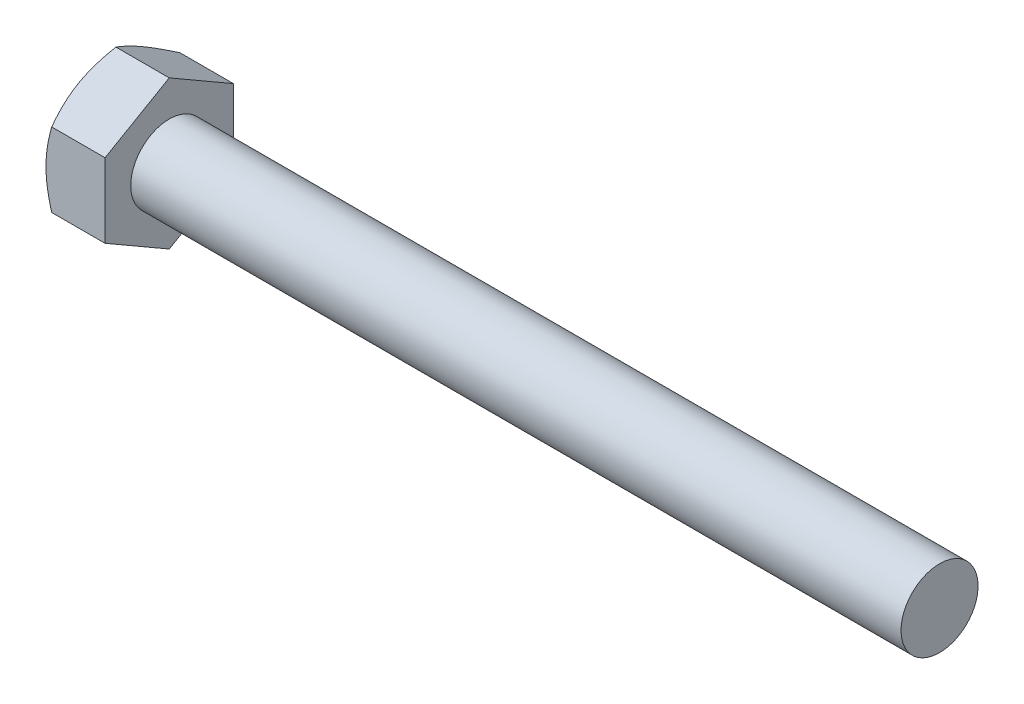
ISO-10303-21;
HEADER;
FILE_DESCRIPTION(('STEP AP214'),'2;1');
FILE_NAME('part.step','',(''),(''),'','','');
FILE_SCHEMA(('AUTOMOTIVE_DESIGN { 1 0 10303 214 1 1 1 1 }'));
ENDSEC;
DATA;
#1=APPLICATION_CONTEXT('core data for automotive mechanical design processes');
#2=APPLICATION_PROTOCOL_DEFINITION('international standard','automotive_design',2000,#1);
#3=PRODUCT_CONTEXT('',#1,'mechanical');
#4=PRODUCT('Part','Part','',(#3));
#5=PRODUCT_RELATED_PRODUCT_CATEGORY('part','',(#4));
#6=PRODUCT_DEFINITION_FORMATION('','',#4);
#7=PRODUCT_DEFINITION_CONTEXT('part definition',#1,'design');
#8=PRODUCT_DEFINITION('design','',#6,#7);
#9=PRODUCT_DEFINITION_SHAPE('','',#8);
#10=(LENGTH_UNIT() NAMED_UNIT(*) SI_UNIT(.MILLI.,.METRE.));
#11=(NAMED_UNIT(*) PLANE_ANGLE_UNIT() SI_UNIT($,.RADIAN.));
#12=(NAMED_UNIT(*) SI_UNIT($,.STERADIAN.) SOLID_ANGLE_UNIT());
#13=UNCERTAINTY_MEASURE_WITH_UNIT(LENGTH_MEASURE(1.E-05),#10,'distance_accuracy_value','');
#14=(GEOMETRIC_REPRESENTATION_CONTEXT(3) GLOBAL_UNCERTAINTY_ASSIGNED_CONTEXT((#13)) GLOBAL_UNIT_ASSIGNED_CONTEXT((#10,
#11,#12)) REPRESENTATION_CONTEXT('',''));
#15=CARTESIAN_POINT('',(0.,0.,0.));
#16=DIRECTION('',(0.,0.,1.));
#17=DIRECTION('',(1.,0.,0.));
#18=AXIS2_PLACEMENT_3D('',#15,#16,#17);
#19=CARTESIAN_POINT('',(0.,0.,0.));
#20=DIRECTION('',(-1.,0.,0.));
#21=DIRECTION('',(0.,0.,1.));
#22=AXIS2_PLACEMENT_3D('',#19,#20,#21);
#23=PLANE('',#22);
#24=CARTESIAN_POINT('',(0.,0.,0.));
#25=DIRECTION('',(-1.,0.,0.));
#26=DIRECTION('',(0.,0.,1.));
#27=AXIS2_PLACEMENT_3D('',#24,#25,#26);
#28=CIRCLE('',#27,2.5);
#29=CARTESIAN_POINT('',(0.,0.,2.5));
#30=VERTEX_POINT('',#29);
#31=CARTESIAN_POINT('',(0.,2.16506351419174,1.25000000819361));
#32=VERTEX_POINT('',#31);
#33=EDGE_CURVE('E40',#30,#32,#28,.T.);
#34=ORIENTED_EDGE('',*,*,#33,.T.);
#35=CARTESIAN_POINT('',(0.,2.16506351419174,-1.25000000819361));
#36=VERTEX_POINT('',#35);
#37=EDGE_CURVE('E196',#32,#36,#28,.T.);
#38=ORIENTED_EDGE('',*,*,#37,.T.);
#39=CARTESIAN_POINT('',(0.,0.,-2.5));
#40=VERTEX_POINT('',#39);
#41=EDGE_CURVE('E201',#36,#40,#28,.T.);
#42=ORIENTED_EDGE('',*,*,#41,.T.);
#43=CARTESIAN_POINT('',(0.,-2.16506351419155,-1.2500000081935));
#44=VERTEX_POINT('',#43);
#45=EDGE_CURVE('E205',#40,#44,#28,.T.);
#46=ORIENTED_EDGE('',*,*,#45,.T.);
#47=CARTESIAN_POINT('',(0.,-2.16506351419155,1.25000000819349));
#48=VERTEX_POINT('',#47);
#49=EDGE_CURVE('E202',#44,#48,#28,.T.);
#50=ORIENTED_EDGE('',*,*,#49,.T.);
#51=EDGE_CURVE('E194',#48,#30,#28,.T.);
#52=ORIENTED_EDGE('',*,*,#51,.T.);
#53=EDGE_LOOP('',(#34,#38,#42,#46,#50,#52));
#54=FACE_BOUND('',#53,.T.);
#55=CARTESIAN_POINT('',(0.,0.,0.));
#56=DIRECTION('',(1.,0.,0.));
#57=DIRECTION('',(0.,0.,-1.));
#58=AXIS2_PLACEMENT_3D('',#55,#56,#57);
#59=CIRCLE('',#58,2.1875);
#60=CARTESIAN_POINT('',(0.,0.,-2.1875));
#61=VERTEX_POINT('',#60);
#62=EDGE_CURVE('E233',#61,#61,#59,.T.);
#63=ORIENTED_EDGE('',*,*,#62,.T.);
#64=EDGE_LOOP('',(#63));
#65=FACE_BOUND('',#64,.T.);
#66=ADVANCED_FACE('F32',(#54,#65),#23,.T.);
#67=CARTESIAN_POINT('',(2.3,1.5,0.));
#68=DIRECTION('',(-1.,0.,0.));
#69=DIRECTION('',(0.,0.,1.));
#70=AXIS2_PLACEMENT_3D('',#67,#68,#69);
#71=PLANE('',#70);
#72=CARTESIAN_POINT('',(2.3,0.,0.));
#73=DIRECTION('',(-1.,0.,0.));
#74=DIRECTION('',(0.,0.,1.));
#75=AXIS2_PLACEMENT_3D('',#72,#73,#74);
#76=CIRCLE('',#75,1.5);
#77=CARTESIAN_POINT('',(2.3,0.,1.5));
#78=VERTEX_POINT('',#77);
#79=EDGE_CURVE('E192',#78,#78,#76,.T.);
#80=ORIENTED_EDGE('',*,*,#79,.T.);
#81=EDGE_LOOP('',(#80));
#82=FACE_BOUND('',#81,.T.);
#83=DIRECTION('',(0.,1.,0.));
#84=VECTOR('',#83,1.);
#85=CARTESIAN_POINT('',(2.3,-1.44337567928133,2.5));
#86=LINE('',#85,#84);
#87=CARTESIAN_POINT('',(2.3,-1.44337567928133,2.5));
#88=VERTEX_POINT('',#87);
#89=CARTESIAN_POINT('',(2.3,1.44337567928159,2.5));
#90=VERTEX_POINT('',#89);
#91=EDGE_CURVE('E55',#88,#90,#86,.T.);
#92=ORIENTED_EDGE('',*,*,#91,.F.);
#93=DIRECTION('',(0.,0.50000000163871,0.866025402838329));
#94=VECTOR('',#93,1.);
#95=CARTESIAN_POINT('',(2.3,-2.8867513585628,0.));
#96=LINE('',#95,#94);
#97=CARTESIAN_POINT('',(2.3,-2.8867513585628,0.));
#98=VERTEX_POINT('',#97);
#99=EDGE_CURVE('E129',#98,#88,#96,.T.);
#100=ORIENTED_EDGE('',*,*,#99,.F.);
#101=DIRECTION('',(0.,-0.50000000163871,0.866025402838329));
#102=VECTOR('',#101,1.);
#103=CARTESIAN_POINT('',(2.3,-1.44337567928133,-2.5));
#104=LINE('',#103,#102);
#105=CARTESIAN_POINT('',(2.3,-1.44337567928133,-2.5));
#106=VERTEX_POINT('',#105);
#107=EDGE_CURVE('E127',#106,#98,#104,.T.);
#108=ORIENTED_EDGE('',*,*,#107,.F.);
#109=DIRECTION('',(0.,-1.,0.));
#110=VECTOR('',#109,1.);
#111=CARTESIAN_POINT('',(2.3,1.44337567928159,-2.5));
#112=LINE('',#111,#110);
#113=CARTESIAN_POINT('',(2.3,1.44337567928159,-2.5));
#114=VERTEX_POINT('',#113);
#115=EDGE_CURVE('E109',#114,#106,#112,.T.);
#116=ORIENTED_EDGE('',*,*,#115,.F.);
#117=DIRECTION('',(0.,-0.500000001638711,-0.866025402838329));
#118=VECTOR('',#117,1.);
#119=CARTESIAN_POINT('',(2.3,2.88675135856305,0.));
#120=LINE('',#119,#118);
#121=CARTESIAN_POINT('',(2.3,2.88675135856305,0.));
#122=VERTEX_POINT('',#121);
#123=EDGE_CURVE('E118',#122,#114,#120,.T.);
#124=ORIENTED_EDGE('',*,*,#123,.F.);
#125=DIRECTION('',(0.,0.50000000163871,-0.866025402838329));
#126=VECTOR('',#125,1.);
#127=CARTESIAN_POINT('',(2.3,1.44337567928159,2.5));
#128=LINE('',#127,#126);
#129=EDGE_CURVE('E122',#90,#122,#128,.T.);
#130=ORIENTED_EDGE('',*,*,#129,.F.);
#131=EDGE_LOOP('',(#92,#100,#108,#116,#124,#130));
#132=FACE_BOUND('',#131,.T.);
#133=ADVANCED_FACE('F124',(#82,#132),#71,.F.);
#134=CARTESIAN_POINT('',(-25.4,0.,0.));
#135=DIRECTION('',(-1.,0.,0.));
#136=DIRECTION('',(0.,0.,1.));
#137=AXIS2_PLACEMENT_3D('',#134,#135,#136);
#138=CYLINDRICAL_SURFACE('',#137,1.5);
#139=CARTESIAN_POINT('',(32.3,0.,0.));
#140=DIRECTION('',(-1.,0.,0.));
#141=DIRECTION('',(0.,0.,1.));
#142=AXIS2_PLACEMENT_3D('',#139,#140,#141);
#143=CIRCLE('',#142,1.5);
#144=CARTESIAN_POINT('',(32.3,0.,1.5));
#145=VERTEX_POINT('',#144);
#146=EDGE_CURVE('E11',#145,#145,#143,.T.);
#147=ORIENTED_EDGE('',*,*,#146,.T.);
#148=EDGE_LOOP('',(#147));
#149=FACE_BOUND('',#148,.T.);
#150=ORIENTED_EDGE('',*,*,#79,.F.);
#151=EDGE_LOOP('',(#150));
#152=FACE_BOUND('',#151,.T.);
#153=ADVANCED_FACE('F34',(#149,#152),#138,.T.);
#154=CARTESIAN_POINT('',(32.3,1.5,0.));
#155=DIRECTION('',(1.,0.,0.));
#156=DIRECTION('',(0.,0.,-1.));
#157=AXIS2_PLACEMENT_3D('',#154,#155,#156);
#158=PLANE('',#157);
#159=ORIENTED_EDGE('',*,*,#146,.F.);
#160=EDGE_LOOP('',(#159));
#161=FACE_BOUND('',#160,.T.);
#162=ADVANCED_FACE('F175',(#161),#158,.T.);
#163=CARTESIAN_POINT('',(2.3,-1.44337567928133,2.5));
#164=DIRECTION('',(0.,0.,1.));
#165=DIRECTION('',(0.,-1.,0.));
#166=AXIS2_PLACEMENT_3D('',#163,#164,#165);
#167=PLANE('',#166);
#168=DIRECTION('',(-1.,0.,0.));
#169=VECTOR('',#168,1.);
#170=CARTESIAN_POINT('',(2.3,-1.44337567928133,2.5));
#171=LINE('',#170,#169);
#172=CARTESIAN_POINT('',(0.223290995513354,-1.44337567928133,2.5));
#173=VERTEX_POINT('',#172);
#174=EDGE_CURVE('E136',#88,#173,#171,.T.);
#175=ORIENTED_EDGE('',*,*,#174,.F.);
#176=ORIENTED_EDGE('',*,*,#91,.T.);
#177=DIRECTION('',(-1.,0.,0.));
#178=VECTOR('',#177,1.);
#179=CARTESIAN_POINT('',(2.3,1.44337567928159,2.5));
#180=LINE('',#179,#178);
#181=CARTESIAN_POINT('',(0.223290995513426,1.44337567928159,2.5));
#182=VERTEX_POINT('',#181);
#183=EDGE_CURVE('E135',#90,#182,#180,.T.);
#184=ORIENTED_EDGE('',*,*,#183,.T.);
#185=CARTESIAN_POINT('',(1.19632004406595,-3.82805178069449,2.5));
#186=CARTESIAN_POINT('',(1.14327589629636,-3.7182875906123,2.5));
#187=CARTESIAN_POINT('',(1.09075904917703,-3.60826388251005,2.5));
#188=CARTESIAN_POINT('',(0.987081273872629,-3.38755710903453,2.5));
#189=CARTESIAN_POINT('',(0.935920580448254,-3.27687393351173,2.5));
#190=CARTESIAN_POINT('',(0.834986914311905,-3.05411000573681,2.5));
#191=CARTESIAN_POINT('',(0.785223558317014,-2.94202488038616,2.5));
#192=CARTESIAN_POINT('',(0.687834293242499,-2.71693339089507,2.5));
#193=CARTESIAN_POINT('',(0.64020827274816,-2.60392707513802,2.5));
#194=CARTESIAN_POINT('',(0.547096599216495,-2.37541055612811,2.5));
#195=CARTESIAN_POINT('',(0.501644402476205,-2.25988664554279,2.5));
#196=CARTESIAN_POINT('',(0.414299798759199,-2.02747621227372,2.5));
#197=CARTESIAN_POINT('',(0.372407787833692,-1.91058953963062,2.5));
#198=CARTESIAN_POINT('',(0.293309177636011,-1.67550769213624,2.5));
#199=CARTESIAN_POINT('',(0.25609261725792,-1.55731590352552,2.5));
#200=CARTESIAN_POINT('',(0.187553577101156,-1.31925207497197,2.5));
#201=CARTESIAN_POINT('',(0.156229233411223,-1.19938057931484,2.5));
#202=CARTESIAN_POINT('',(0.100995335359192,-0.957875466950474,2.5));
#203=CARTESIAN_POINT('',(0.0770877549190802,-0.836241390144261,2.5));
#204=CARTESIAN_POINT('',(0.038297067354997,-0.591506739851932,2.5));
#205=CARTESIAN_POINT('',(0.0234139682023205,-0.468406165070562,2.5));
#206=CARTESIAN_POINT('',(0.00398887707067124,-0.222162283708564,2.5));
#207=CARTESIAN_POINT('',(-0.000618582954531749,-0.0990242760150257,2.5));
#208=CARTESIAN_POINT('',(0.000752385125690082,0.147165525321938,2.5));
#209=CARTESIAN_POINT('',(0.00672806531326639,0.270217333048273,2.5));
#210=CARTESIAN_POINT('',(0.0255487226845887,0.480345911839685,2.5));
#211=CARTESIAN_POINT('',(0.035942719418275,0.567654504214298,2.5));
#212=CARTESIAN_POINT('',(0.06138257495136,0.741597260879314,2.5));
#213=CARTESIAN_POINT('',(0.0764291673933794,0.828231316595431,2.5));
#214=CARTESIAN_POINT('',(0.127758160854861,1.0870510539617,2.5));
#215=CARTESIAN_POINT('',(0.170216562336699,1.258023566365,2.5));
#216=CARTESIAN_POINT('',(0.243445888381075,1.51385794210056,2.5));
#217=CARTESIAN_POINT('',(0.269819264012636,1.60005333907683,2.5));
#218=CARTESIAN_POINT('',(0.325175689355993,1.7715444847852,2.5));
#219=CARTESIAN_POINT('',(0.354156939094439,1.8568408093229,2.5));
#220=CARTESIAN_POINT('',(0.414126062328039,2.02617712827433,2.5));
#221=CARTESIAN_POINT('',(0.445101723039572,2.11022149180121,2.5));
#222=CARTESIAN_POINT('',(0.508871156887613,2.27765814571535,2.5));
#223=CARTESIAN_POINT('',(0.541665664837581,2.36105015679791,2.5));
#224=CARTESIAN_POINT('',(0.575190110848548,2.44414064056434,2.5));
#225=B_SPLINE_CURVE_WITH_KNOTS('',3,(#185,#186,#187,#188,#189,#190,#191,#192,#193,#194,#195,
#196,#197,#198,#199,#200,#201,#202,#203,#204,#205,#206,#207,#208,#209,#210,#211,#212,#213,#214,
#215,#216,#217,#218,#219,#220,#221,#222,#223,#224),.UNSPECIFIED.,.F.,.F.,(4,2,2,2,2,2,2,2,2,2,2,
2,2,2,2,2,2,2,2,4),(0.,0.365732583178816,0.731528069426235,1.0994168436567,1.46728641830588,
1.83967239293614,2.21209973939173,2.58371966044213,2.95522182687511,3.32682278147237,
3.69842406430308,4.06765095845392,4.43678199670504,4.70042859172476,4.96411678096691,
5.49188560395094,5.76228383952689,6.03249685521827,6.30118893346183,6.56999036530353),.UNSPECIFIED.);
#226=EDGE_CURVE('E177',#30,#182,#225,.T.);
#227=ORIENTED_EDGE('',*,*,#226,.F.);
#228=EDGE_CURVE('E184',#173,#30,#225,.T.);
#229=ORIENTED_EDGE('',*,*,#228,.F.);
#230=EDGE_LOOP('',(#175,#176,#184,#227,#229));
#231=FACE_BOUND('',#230,.T.);
#232=ADVANCED_FACE('F171',(#231),#167,.T.);
#233=CARTESIAN_POINT('',(2.3,-2.8867513585628,0.));
#234=DIRECTION('',(0.,-0.866025402838329,0.50000000163871));
#235=DIRECTION('',(0.,-0.50000000163871,-0.866025402838329));
#236=AXIS2_PLACEMENT_3D('',#233,#234,#235);
#237=PLANE('',#236);
#238=DIRECTION('',(-1.,0.,0.));
#239=VECTOR('',#238,1.);
#240=CARTESIAN_POINT('',(2.3,-2.8867513585628,0.));
#241=LINE('',#240,#239);
#242=CARTESIAN_POINT('',(0.223291000975684,-2.8867513585628,0.));
#243=VERTEX_POINT('',#242);
#244=EDGE_CURVE('E140',#98,#243,#241,.T.);
#245=ORIENTED_EDGE('',*,*,#244,.F.);
#246=ORIENTED_EDGE('',*,*,#99,.T.);
#247=ORIENTED_EDGE('',*,*,#174,.T.);
#248=CARTESIAN_POINT('',(0.223357671642482,-2.88686682861714,-0.000200000000002143));
#249=CARTESIAN_POINT('',(0.186721627123145,-2.823437260003,0.109663235061769));
#250=CARTESIAN_POINT('',(0.153402225713999,-2.75946017255779,0.220474800552922));
#251=CARTESIAN_POINT('',(0.0952422917887068,-2.63039811834957,0.444016834793908));
#252=CARTESIAN_POINT('',(0.0704223351272897,-2.5653108579734,0.556751276198269));
#253=CARTESIAN_POINT('',(0.0317856569546174,-2.43594298952786,0.780822996233657));
#254=CARTESIAN_POINT('',(0.0177118014837253,-2.37168228872263,0.892125794471915));
#255=CARTESIAN_POINT('',(0.00090915726963869,-2.24285844798616,1.11525523087859));
#256=CARTESIAN_POINT('',(-0.00183354404533533,-2.17829577643782,1.22708105778404));
#257=CARTESIAN_POINT('',(0.00386576449219331,-2.05765213161006,1.43604197932287));
#258=CARTESIAN_POINT('',(0.0109083986955486,-2.00155311785805,1.53320832097125));
#259=CARTESIAN_POINT('',(0.0332314230427739,-1.88972058300822,1.72690795242393));
#260=CARTESIAN_POINT('',(0.0485194421325142,-1.83398744884957,1.82344057202992));
#261=CARTESIAN_POINT('',(0.0867390970453047,-1.7219242510559,2.01753972341901));
#262=CARTESIAN_POINT('',(0.109832779058663,-1.66560837412358,2.11508168311234));
#263=CARTESIAN_POINT('',(0.162246658960904,-1.55381666130744,2.3087106087289));
#264=CARTESIAN_POINT('',(0.191554537725399,-1.49833939269559,2.40480005620986));
#265=CARTESIAN_POINT('',(0.223357666179496,-1.44326020922699,2.5002));
#266=B_SPLINE_CURVE_WITH_KNOTS('',3,(#248,#249,#250,#251,#252,#253,#254,#255,#256,#257,#258,
#259,#260,#261,#262,#263,#264,#265),.UNSPECIFIED.,.F.,.F.,(4,2,2,2,2,2,2,2,4),(0.,
0.396285829073732,0.793524333587548,1.18093087363639,1.56786160813528,1.90479742383017,
2.24204552159359,2.58677531937551,2.93082800409492),.UNSPECIFIED.);
#267=EDGE_CURVE('E186',#48,#173,#266,.T.);
#268=ORIENTED_EDGE('',*,*,#267,.F.);
#269=EDGE_CURVE('E185',#243,#48,#266,.T.);
#270=ORIENTED_EDGE('',*,*,#269,.F.);
#271=EDGE_LOOP('',(#245,#246,#247,#268,#270));
#272=FACE_BOUND('',#271,.T.);
#273=ADVANCED_FACE('F174',(#272),#237,.T.);
#274=CARTESIAN_POINT('',(2.3,-1.44337567928133,-2.5));
#275=DIRECTION('',(0.,-0.866025402838329,-0.500000001638711));
#276=DIRECTION('',(0.,0.500000001638711,-0.866025402838329));
#277=AXIS2_PLACEMENT_3D('',#274,#275,#276);
#278=PLANE('',#277);
#279=DIRECTION('',(-1.,0.,0.));
#280=VECTOR('',#279,1.);
#281=CARTESIAN_POINT('',(2.3,-1.44337567928133,-2.5));
#282=LINE('',#281,#280);
#283=CARTESIAN_POINT('',(0.223290995513354,-1.44337567928133,-2.5));
#284=VERTEX_POINT('',#283);
#285=EDGE_CURVE('E115',#106,#284,#282,.T.);
#286=ORIENTED_EDGE('',*,*,#285,.F.);
#287=ORIENTED_EDGE('',*,*,#107,.T.);
#288=ORIENTED_EDGE('',*,*,#244,.T.);
#289=CARTESIAN_POINT('',(0.223357666179497,-1.44326020922699,-2.5002));
#290=CARTESIAN_POINT('',(0.186721622105298,-1.5066897776876,-2.39033676520415));
#291=CARTESIAN_POINT('',(0.153402221169773,-1.57066686497833,-2.27952519998057));
#292=CARTESIAN_POINT('',(0.0952422882291777,-1.69972891886277,-2.05598316630038));
#293=CARTESIAN_POINT('',(0.0704223320783233,-1.76481617906955,-1.94324872518942));
#294=CARTESIAN_POINT('',(0.0317856549217439,-1.89418404716996,-1.71917700575181));
#295=CARTESIAN_POINT('',(0.0177117999573072,-1.95844474779999,-1.60787420781702));
#296=CARTESIAN_POINT('',(0.000909156719706351,-2.08726858816535,-1.38474477205312));
#297=CARTESIAN_POINT('',(-0.00183354412492823,-2.15183125951782,-1.27291894548693));
#298=CARTESIAN_POINT('',(0.00386576523131461,-2.2724749043379,-1.06395802396141));
#299=CARTESIAN_POINT('',(0.0109083998520712,-2.3285739182796,-0.966791681984467));
#300=CARTESIAN_POINT('',(0.0332314250552679,-2.44040645349358,-0.773092049901065));
#301=CARTESIAN_POINT('',(0.0485194445836655,-2.49613958782666,-0.676559429992937));
#302=CARTESIAN_POINT('',(0.0867391003778076,-2.60820278596567,-0.482460278005714));
#303=CARTESIAN_POINT('',(0.109832782834313,-2.66451866306857,-0.384918318016943));
#304=CARTESIAN_POINT('',(0.162246663600416,-2.77631037621612,-0.191289391826351));
#305=CARTESIAN_POINT('',(0.191554542785451,-2.83178764498885,-0.0951999440667299));
#306=CARTESIAN_POINT('',(0.223357671642482,-2.88686682861714,0.000199999999997729));
#307=B_SPLINE_CURVE_WITH_KNOTS('',3,(#289,#290,#291,#292,#293,#294,#295,#296,#297,#298,#299,
#300,#301,#302,#303,#304,#305,#306),.UNSPECIFIED.,.F.,.F.,(4,2,2,2,2,2,2,2,4),(0.,
0.396285827816312,0.793524331042151,1.18093086988015,1.56786160317875,1.90479742008592,
2.24204551906553,2.58677531811864,2.9308280040949),.UNSPECIFIED.);
#308=EDGE_CURVE('E215',#44,#243,#307,.T.);
#309=ORIENTED_EDGE('',*,*,#308,.F.);
#310=EDGE_CURVE('E220',#284,#44,#307,.T.);
#311=ORIENTED_EDGE('',*,*,#310,.F.);
#312=EDGE_LOOP('',(#286,#287,#288,#309,#311));
#313=FACE_BOUND('',#312,.T.);
#314=ADVANCED_FACE('F292',(#313),#278,.T.);
#315=CARTESIAN_POINT('',(2.3,1.44337567928159,-2.5));
#316=DIRECTION('',(0.,0.,-1.));
#317=DIRECTION('',(-1.,0.,0.));
#318=AXIS2_PLACEMENT_3D('',#315,#316,#317);
#319=PLANE('',#318);
#320=DIRECTION('',(-1.,0.,0.));
#321=VECTOR('',#320,1.);
#322=CARTESIAN_POINT('',(2.3,1.44337567928159,-2.5));
#323=LINE('',#322,#321);
#324=CARTESIAN_POINT('',(0.223290995513428,1.44337567928159,-2.5));
#325=VERTEX_POINT('',#324);
#326=EDGE_CURVE('E104',#114,#325,#323,.T.);
#327=ORIENTED_EDGE('',*,*,#326,.F.);
#328=ORIENTED_EDGE('',*,*,#115,.T.);
#329=ORIENTED_EDGE('',*,*,#285,.T.);
#330=CARTESIAN_POINT('',(1.19632004406595,-3.82805178069449,-2.5));
#331=CARTESIAN_POINT('',(1.14327589629636,-3.7182875906123,-2.5));
#332=CARTESIAN_POINT('',(1.09075904917702,-3.60826388251005,-2.5));
#333=CARTESIAN_POINT('',(0.987081273872628,-3.38755710903453,-2.5));
#334=CARTESIAN_POINT('',(0.935920580448254,-3.27687393351173,-2.5));
#335=CARTESIAN_POINT('',(0.834986914311905,-3.05411000573681,-2.5));
#336=CARTESIAN_POINT('',(0.785223558317014,-2.94202488038616,-2.5));
#337=CARTESIAN_POINT('',(0.687834293242499,-2.71693339089507,-2.5));
#338=CARTESIAN_POINT('',(0.64020827274816,-2.60392707513802,-2.5));
#339=CARTESIAN_POINT('',(0.547096599216495,-2.37541055612811,-2.5));
#340=CARTESIAN_POINT('',(0.501644402476205,-2.25988664554279,-2.5));
#341=CARTESIAN_POINT('',(0.414299798759198,-2.02747621227372,-2.5));
#342=CARTESIAN_POINT('',(0.372407787833692,-1.91058953963062,-2.5));
#343=CARTESIAN_POINT('',(0.293309177636012,-1.67550769213624,-2.5));
#344=CARTESIAN_POINT('',(0.25609261725792,-1.55731590352552,-2.5));
#345=CARTESIAN_POINT('',(0.187553577101156,-1.31925207497197,-2.5));
#346=CARTESIAN_POINT('',(0.156229233411224,-1.19938057931484,-2.5));
#347=CARTESIAN_POINT('',(0.100995335359192,-0.957875466950475,-2.5));
#348=CARTESIAN_POINT('',(0.0770877549190807,-0.836241390144261,-2.5));
#349=CARTESIAN_POINT('',(0.0382970673549975,-0.591506739851933,-2.5));
#350=CARTESIAN_POINT('',(0.0234139682023211,-0.468406165070562,-2.5));
#351=CARTESIAN_POINT('',(0.00398887707067217,-0.222162283708564,-2.5));
#352=CARTESIAN_POINT('',(-0.000618582954530538,-0.099024276015026,-2.5));
#353=CARTESIAN_POINT('',(0.00075238512569141,0.147165525321938,-2.5));
#354=CARTESIAN_POINT('',(0.00672806531326759,0.270217333048273,-2.5));
#355=CARTESIAN_POINT('',(0.02554872268459,0.480345911839686,-2.5));
#356=CARTESIAN_POINT('',(0.0359427194182764,0.567654504214298,-2.5));
#357=CARTESIAN_POINT('',(0.0613825749513615,0.741597260879314,-2.5));
#358=CARTESIAN_POINT('',(0.076429167393381,0.828231316595431,-2.5));
#359=CARTESIAN_POINT('',(0.127758160854862,1.0870510539617,-2.5));
#360=CARTESIAN_POINT('',(0.170216562336701,1.258023566365,-2.5));
#361=CARTESIAN_POINT('',(0.243445888381077,1.51385794210056,-2.5));
#362=CARTESIAN_POINT('',(0.269819264012639,1.60005333907683,-2.5));
#363=CARTESIAN_POINT('',(0.325175689355996,1.7715444847852,-2.5));
#364=CARTESIAN_POINT('',(0.354156939094442,1.8568408093229,-2.5));
#365=CARTESIAN_POINT('',(0.414126062328042,2.02617712827433,-2.5));
#366=CARTESIAN_POINT('',(0.445101723039575,2.11022149180121,-2.5));
#367=CARTESIAN_POINT('',(0.508871156887616,2.27765814571535,-2.5));
#368=CARTESIAN_POINT('',(0.541665664837584,2.36105015679791,-2.5));
#369=CARTESIAN_POINT('',(0.575190110848552,2.44414064056434,-2.5));
#370=B_SPLINE_CURVE_WITH_KNOTS('',3,(#330,#331,#332,#333,#334,#335,#336,#337,#338,#339,#340,
#341,#342,#343,#344,#345,#346,#347,#348,#349,#350,#351,#352,#353,#354,#355,#356,#357,#358,#359,
#360,#361,#362,#363,#364,#365,#366,#367,#368,#369),.UNSPECIFIED.,.F.,.F.,(4,2,2,2,2,2,2,2,2,2,2,
2,2,2,2,2,2,2,2,4),(0.,0.365732583178816,0.731528069426235,1.0994168436567,1.46728641830589,
1.83967239293614,2.21209973939173,2.58371966044213,2.95522182687511,3.32682278147237,
3.69842406430308,4.06765095845392,4.43678199670504,4.70042859172476,4.96411678096691,
5.49188560395094,5.7622838395269,6.03249685521827,6.30118893346184,6.56999036530353),.UNSPECIFIED.);
#371=EDGE_CURVE('E216',#40,#284,#370,.F.);
#372=ORIENTED_EDGE('',*,*,#371,.F.);
#373=EDGE_CURVE('E112',#325,#40,#370,.F.);
#374=ORIENTED_EDGE('',*,*,#373,.F.);
#375=EDGE_LOOP('',(#327,#328,#329,#372,#374));
#376=FACE_BOUND('',#375,.T.);
#377=ADVANCED_FACE('F106',(#376),#319,.T.);
#378=CARTESIAN_POINT('',(2.3,2.88675135856305,0.));
#379=DIRECTION('',(0.,0.866025402838329,-0.500000001638711));
#380=DIRECTION('',(0.,0.500000001638711,0.866025402838329));
#381=AXIS2_PLACEMENT_3D('',#378,#379,#380);
#382=PLANE('',#381);
#383=DIRECTION('',(-1.,0.,0.));
#384=VECTOR('',#383,1.);
#385=CARTESIAN_POINT('',(2.3,2.88675135856305,0.));
#386=LINE('',#385,#384);
#387=CARTESIAN_POINT('',(0.223291000975832,2.88675135856305,0.));
#388=VERTEX_POINT('',#387);
#389=EDGE_CURVE('E47',#122,#388,#386,.T.);
#390=ORIENTED_EDGE('',*,*,#389,.F.);
#391=ORIENTED_EDGE('',*,*,#123,.T.);
#392=ORIENTED_EDGE('',*,*,#326,.T.);
#393=CARTESIAN_POINT('',(0.22335767164263,2.8868668286174,0.000199999999997561));
#394=CARTESIAN_POINT('',(0.18672162712329,2.82343726000325,-0.109663235061783));
#395=CARTESIAN_POINT('',(0.153402225714141,2.75946017255803,-0.220474800552946));
#396=CARTESIAN_POINT('',(0.0952422917888434,2.6303981183498,-0.444016834793951));
#397=CARTESIAN_POINT('',(0.0704223351274241,2.56531085797362,-0.556751276198322));
#398=CARTESIAN_POINT('',(0.0317856569547485,2.43594298952808,-0.78082299623373));
#399=CARTESIAN_POINT('',(0.0177118014838551,2.37168228872284,-0.892125794471997));
#400=CARTESIAN_POINT('',(0.000909157269767128,2.24285844798636,-1.1152552308787));
#401=CARTESIAN_POINT('',(-0.00183354404520703,2.17829577643801,-1.22708105778415));
#402=CARTESIAN_POINT('',(0.00386576449232183,2.05765213161025,-1.43604197932298));
#403=CARTESIAN_POINT('',(0.0109083986956756,2.00155311785825,-1.53320832097135));
#404=CARTESIAN_POINT('',(0.0332314230428954,1.88972058300843,-1.72690795242401));
#405=CARTESIAN_POINT('',(0.0485194421326316,1.83398744884979,-1.82344057202999));
#406=CARTESIAN_POINT('',(0.0867390970454121,1.72192425105612,-2.01753972341906));
#407=CARTESIAN_POINT('',(0.109832779058765,1.66560837412381,-2.11508168311238));
#408=CARTESIAN_POINT('',(0.162246658960993,1.55381666130769,-2.30871060872892));
#409=CARTESIAN_POINT('',(0.19155453772548,1.49833939269584,-2.40480005620987));
#410=CARTESIAN_POINT('',(0.22335766617957,1.44326020922725,-2.5002));
#411=B_SPLINE_CURVE_WITH_KNOTS('',3,(#393,#394,#395,#396,#397,#398,#399,#400,#401,#402,#403,
#404,#405,#406,#407,#408,#409,#410),.UNSPECIFIED.,.F.,.F.,(4,2,2,2,2,2,2,2,4),(0.,
0.396285829073766,0.793524333587617,1.1809308736365,1.56786160813542,1.90479742383028,
2.24204552159366,2.58677531937554,2.93082800409491),.UNSPECIFIED.);
#412=EDGE_CURVE('E154',#36,#325,#411,.T.);
#413=ORIENTED_EDGE('',*,*,#412,.F.);
#414=EDGE_CURVE('E379',#388,#36,#411,.T.);
#415=ORIENTED_EDGE('',*,*,#414,.F.);
#416=EDGE_LOOP('',(#390,#391,#392,#413,#415));
#417=FACE_BOUND('',#416,.T.);
#418=ADVANCED_FACE('F119',(#417),#382,.T.);
#419=CARTESIAN_POINT('',(2.3,1.44337567928159,2.5));
#420=DIRECTION('',(0.,0.866025402838329,0.50000000163871));
#421=DIRECTION('',(0.,-0.50000000163871,0.866025402838329));
#422=AXIS2_PLACEMENT_3D('',#419,#420,#421);
#423=PLANE('',#422);
#424=ORIENTED_EDGE('',*,*,#183,.F.);
#425=ORIENTED_EDGE('',*,*,#129,.T.);
#426=ORIENTED_EDGE('',*,*,#389,.T.);
#427=CARTESIAN_POINT('',(0.223357666179569,1.44326020922725,2.5002));
#428=CARTESIAN_POINT('',(0.186721622105373,1.50668977768786,2.39033676520414));
#429=CARTESIAN_POINT('',(0.153402221169851,1.57066686497859,2.27952519998055));
#430=CARTESIAN_POINT('',(0.0952422882292643,1.69972891886304,2.05598316630036));
#431=CARTESIAN_POINT('',(0.0704223320784148,1.76481617906983,1.94324872518938));
#432=CARTESIAN_POINT('',(0.031785654921846,1.89418404717024,1.71917700575177));
#433=CARTESIAN_POINT('',(0.0177117999574148,1.95844474780027,1.60787420781697));
#434=CARTESIAN_POINT('',(0.000909156719825605,2.08726858816564,1.38474477205306));
#435=CARTESIAN_POINT('',(-0.00183354412480281,2.15183125951811,1.27291894548686));
#436=CARTESIAN_POINT('',(0.00386576523145128,2.27247490433819,1.06395802396134));
#437=CARTESIAN_POINT('',(0.0109083998522121,2.32857391827989,0.966791681984406));
#438=CARTESIAN_POINT('',(0.0332314250554149,2.44040645349386,0.773092049901015));
#439=CARTESIAN_POINT('',(0.0485194445838145,2.49613958782694,0.676559429992892));
#440=CARTESIAN_POINT('',(0.0867391003779589,2.60820278596594,0.482460278005681));
#441=CARTESIAN_POINT('',(0.109832782834465,2.66451866306883,0.384918318016915));
#442=CARTESIAN_POINT('',(0.162246663600566,2.77631037621638,0.191289391826335));
#443=CARTESIAN_POINT('',(0.191554542785601,2.83178764498911,0.0951999440667197));
#444=CARTESIAN_POINT('',(0.22335767164263,2.8868668286174,-0.000200000000002304));
#445=B_SPLINE_CURVE_WITH_KNOTS('',3,(#427,#428,#429,#430,#431,#432,#433,#434,#435,#436,#437,
#438,#439,#440,#441,#442,#443,#444),.UNSPECIFIED.,.F.,.F.,(4,2,2,2,2,2,2,2,4),(0.,
0.39628582781633,0.793524331042186,1.1809308698802,1.56786160317882,1.90479742008597,
2.24204551906556,2.58677531811865,2.93082800409489),.UNSPECIFIED.);
#446=EDGE_CURVE('E139',#32,#388,#445,.T.);
#447=ORIENTED_EDGE('',*,*,#446,.F.);
#448=EDGE_CURVE('E153',#182,#32,#445,.T.);
#449=ORIENTED_EDGE('',*,*,#448,.F.);
#450=EDGE_LOOP('',(#424,#425,#426,#447,#449));
#451=FACE_BOUND('',#450,.T.);
#452=ADVANCED_FACE('F164',(#451),#423,.T.);
#453=CARTESIAN_POINT('',(0.,0.,0.));
#454=DIRECTION('',(1.,0.,0.));
#455=DIRECTION('',(0.,0.,-1.));
#456=AXIS2_PLACEMENT_3D('',#453,#454,#455);
#457=CONICAL_SURFACE('',#456,2.5,1.0471975511966);
#458=ORIENTED_EDGE('',*,*,#51,.F.);
#459=ORIENTED_EDGE('',*,*,#267,.T.);
#460=ORIENTED_EDGE('',*,*,#228,.T.);
#461=EDGE_LOOP('',(#458,#459,#460));
#462=FACE_BOUND('',#461,.T.);
#463=ADVANCED_FACE('F168',(#462),#457,.T.);
#464=ORIENTED_EDGE('',*,*,#49,.F.);
#465=ORIENTED_EDGE('',*,*,#308,.T.);
#466=ORIENTED_EDGE('',*,*,#269,.T.);
#467=EDGE_LOOP('',(#464,#465,#466));
#468=FACE_BOUND('',#467,.T.);
#469=ADVANCED_FACE('F225',(#468),#457,.T.);
#470=ORIENTED_EDGE('',*,*,#371,.T.);
#471=ORIENTED_EDGE('',*,*,#310,.T.);
#472=ORIENTED_EDGE('',*,*,#45,.F.);
#473=EDGE_LOOP('',(#470,#471,#472));
#474=FACE_BOUND('',#473,.T.);
#475=ADVANCED_FACE('F160',(#474),#457,.T.);
#476=ORIENTED_EDGE('',*,*,#412,.T.);
#477=ORIENTED_EDGE('',*,*,#373,.T.);
#478=ORIENTED_EDGE('',*,*,#41,.F.);
#479=EDGE_LOOP('',(#476,#477,#478));
#480=FACE_BOUND('',#479,.T.);
#481=ADVANCED_FACE('F214',(#480),#457,.T.);
#482=ORIENTED_EDGE('',*,*,#33,.F.);
#483=ORIENTED_EDGE('',*,*,#226,.T.);
#484=ORIENTED_EDGE('',*,*,#448,.T.);
#485=EDGE_LOOP('',(#482,#483,#484));
#486=FACE_BOUND('',#485,.T.);
#487=ADVANCED_FACE('F251',(#486),#457,.T.);
#488=ORIENTED_EDGE('',*,*,#446,.T.);
#489=ORIENTED_EDGE('',*,*,#414,.T.);
#490=ORIENTED_EDGE('',*,*,#37,.F.);
#491=EDGE_LOOP('',(#488,#489,#490));
#492=FACE_BOUND('',#491,.T.);
#493=ADVANCED_FACE('F242',(#492),#457,.T.);
#494=CARTESIAN_POINT('',(0.2875,0.,0.));
#495=DIRECTION('',(-1.,0.,0.));
#496=DIRECTION('',(0.,0.,1.));
#497=AXIS2_PLACEMENT_3D('',#494,#495,#496);
#498=CYLINDRICAL_SURFACE('',#497,2.1875);
#499=CARTESIAN_POINT('',(0.2875,0.,0.));
#500=DIRECTION('',(1.,0.,0.));
#501=DIRECTION('',(0.,0.,-1.));
#502=AXIS2_PLACEMENT_3D('',#499,#500,#501);
#503=CIRCLE('',#502,2.1875);
#504=CARTESIAN_POINT('',(0.2875,0.,-2.1875));
#505=VERTEX_POINT('',#504);
#506=EDGE_CURVE('E230',#505,#505,#503,.T.);
#507=ORIENTED_EDGE('',*,*,#506,.T.);
#508=EDGE_LOOP('',(#507));
#509=FACE_BOUND('',#508,.T.);
#510=ORIENTED_EDGE('',*,*,#62,.F.);
#511=EDGE_LOOP('',(#510));
#512=FACE_BOUND('',#511,.T.);
#513=ADVANCED_FACE('F239',(#509,#512),#498,.F.);
#514=CARTESIAN_POINT('',(0.2875,0.,0.));
#515=DIRECTION('',(1.,0.,0.));
#516=DIRECTION('',(0.,0.,-1.));
#517=AXIS2_PLACEMENT_3D('',#514,#515,#516);
#518=PLANE('',#517);
#519=ORIENTED_EDGE('',*,*,#506,.F.);
#520=EDGE_LOOP('',(#519));
#521=FACE_BOUND('',#520,.T.);
#522=ADVANCED_FACE('F241',(#521),#518,.F.);
#523=CLOSED_SHELL('',(#66,#133,#153,#162,#232,#273,#314,#377,#418,#452,#463,#469,#475,#481,#487,
#493,#513,#522));
#524=MANIFOLD_SOLID_BREP('B2',#523);
#525=ADVANCED_BREP_SHAPE_REPRESENTATION('',(#18,#524),#14);
#526=SHAPE_DEFINITION_REPRESENTATION(#9,#525);
ENDSEC;
END-ISO-10303-21;
